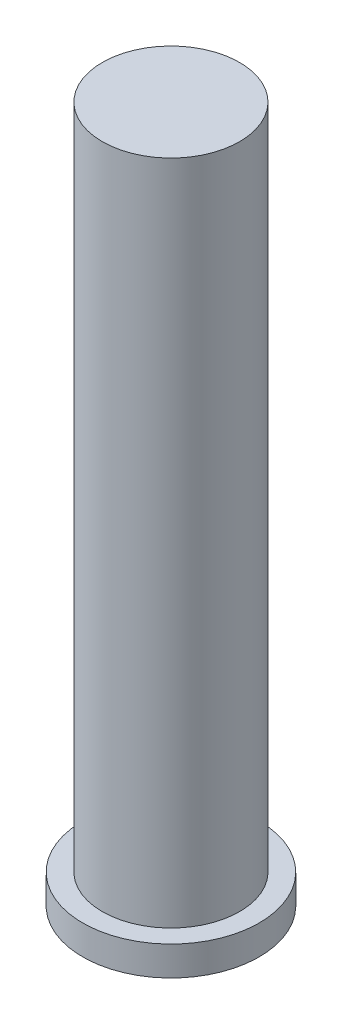
ISO-10303-21;
HEADER;
FILE_DESCRIPTION(('STEP AP214'),'2;1');
FILE_NAME('part.step','',(''),(''),'','','');
FILE_SCHEMA(('AUTOMOTIVE_DESIGN { 1 0 10303 214 1 1 1 1 }'));
ENDSEC;
DATA;
#1=APPLICATION_CONTEXT('core data for automotive mechanical design processes');
#2=APPLICATION_PROTOCOL_DEFINITION('international standard','automotive_design',2000,#1);
#3=PRODUCT_CONTEXT('',#1,'mechanical');
#4=PRODUCT('Part','Part','',(#3));
#5=PRODUCT_RELATED_PRODUCT_CATEGORY('part','',(#4));
#6=PRODUCT_DEFINITION_FORMATION('','',#4);
#7=PRODUCT_DEFINITION_CONTEXT('part definition',#1,'design');
#8=PRODUCT_DEFINITION('design','',#6,#7);
#9=PRODUCT_DEFINITION_SHAPE('','',#8);
#10=(LENGTH_UNIT() NAMED_UNIT(*) SI_UNIT(.MILLI.,.METRE.));
#11=(NAMED_UNIT(*) PLANE_ANGLE_UNIT() SI_UNIT($,.RADIAN.));
#12=(NAMED_UNIT(*) SI_UNIT($,.STERADIAN.) SOLID_ANGLE_UNIT());
#13=UNCERTAINTY_MEASURE_WITH_UNIT(LENGTH_MEASURE(1.E-05),#10,'distance_accuracy_value','');
#14=(GEOMETRIC_REPRESENTATION_CONTEXT(3) GLOBAL_UNCERTAINTY_ASSIGNED_CONTEXT((#13)) GLOBAL_UNIT_ASSIGNED_CONTEXT((#10,
#11,#12)) REPRESENTATION_CONTEXT('',''));
#15=CARTESIAN_POINT('',(0.,0.,0.));
#16=DIRECTION('',(0.,0.,1.));
#17=DIRECTION('',(1.,0.,0.));
#18=AXIS2_PLACEMENT_3D('',#15,#16,#17);
#19=CARTESIAN_POINT('',(0.,0.762,0.));
#20=DIRECTION('',(0.,-1.,0.));
#21=DIRECTION('',(0.,0.,-1.));
#22=AXIS2_PLACEMENT_3D('',#19,#20,#21);
#23=CYLINDRICAL_SURFACE('',#22,2.286);
#24=CARTESIAN_POINT('',(0.,0.762,0.));
#25=DIRECTION('',(0.,1.,0.));
#26=DIRECTION('',(0.,0.,1.));
#27=AXIS2_PLACEMENT_3D('',#24,#25,#26);
#28=CIRCLE('',#27,2.286);
#29=CARTESIAN_POINT('',(0.,0.762,-2.286));
#30=VERTEX_POINT('',#29);
#31=EDGE_CURVE('E40',#30,#30,#28,.T.);
#32=CARTESIAN_POINT('',(0.,0.,0.));
#33=DIRECTION('',(0.,1.,0.));
#34=DIRECTION('',(0.,0.,1.));
#35=AXIS2_PLACEMENT_3D('',#32,#33,#34);
#36=CIRCLE('',#35,2.286);
#37=CARTESIAN_POINT('',(0.,0.,-2.286));
#38=VERTEX_POINT('',#37);
#39=EDGE_CURVE('E36',#38,#38,#36,.T.);
#40=CARTESIAN_POINT('',(0.,0.762,-2.286));
#41=CARTESIAN_POINT('',(0.,0.7540625,-2.286));
#42=CARTESIAN_POINT('',(0.,0.746125,-2.286));
#43=CARTESIAN_POINT('',(0.,0.73025,-2.286));
#44=CARTESIAN_POINT('',(0.,0.7223125,-2.286));
#45=CARTESIAN_POINT('',(0.,0.7064375,-2.286));
#46=CARTESIAN_POINT('',(0.,0.6985,-2.286));
#47=CARTESIAN_POINT('',(0.,0.682625,-2.286));
#48=CARTESIAN_POINT('',(0.,0.6746875,-2.286));
#49=CARTESIAN_POINT('',(0.,0.6588125,-2.286));
#50=CARTESIAN_POINT('',(0.,0.650875,-2.286));
#51=CARTESIAN_POINT('',(0.,0.635,-2.286));
#52=CARTESIAN_POINT('',(0.,0.6270625,-2.286));
#53=CARTESIAN_POINT('',(0.,0.6111875,-2.286));
#54=CARTESIAN_POINT('',(0.,0.60325,-2.286));
#55=CARTESIAN_POINT('',(0.,0.587375,-2.286));
#56=CARTESIAN_POINT('',(0.,0.5794375,-2.286));
#57=CARTESIAN_POINT('',(0.,0.5635625,-2.286));
#58=CARTESIAN_POINT('',(0.,0.555625,-2.286));
#59=CARTESIAN_POINT('',(0.,0.53975,-2.286));
#60=CARTESIAN_POINT('',(0.,0.5318125,-2.286));
#61=CARTESIAN_POINT('',(0.,0.5159375,-2.286));
#62=CARTESIAN_POINT('',(0.,0.508,-2.286));
#63=CARTESIAN_POINT('',(0.,0.492125,-2.286));
#64=CARTESIAN_POINT('',(0.,0.4841875,-2.286));
#65=CARTESIAN_POINT('',(0.,0.4683125,-2.286));
#66=CARTESIAN_POINT('',(0.,0.460375,-2.286));
#67=CARTESIAN_POINT('',(0.,0.4445,-2.286));
#68=CARTESIAN_POINT('',(0.,0.4365625,-2.286));
#69=CARTESIAN_POINT('',(0.,0.4206875,-2.286));
#70=CARTESIAN_POINT('',(0.,0.41275,-2.286));
#71=CARTESIAN_POINT('',(0.,0.396875,-2.286));
#72=CARTESIAN_POINT('',(0.,0.3889375,-2.286));
#73=CARTESIAN_POINT('',(0.,0.3730625,-2.286));
#74=CARTESIAN_POINT('',(0.,0.365125,-2.286));
#75=CARTESIAN_POINT('',(0.,0.34925,-2.286));
#76=CARTESIAN_POINT('',(0.,0.3413125,-2.286));
#77=CARTESIAN_POINT('',(0.,0.3254375,-2.286));
#78=CARTESIAN_POINT('',(0.,0.3175,-2.286));
#79=CARTESIAN_POINT('',(0.,0.301625,-2.286));
#80=CARTESIAN_POINT('',(0.,0.2936875,-2.286));
#81=CARTESIAN_POINT('',(0.,0.2778125,-2.286));
#82=CARTESIAN_POINT('',(0.,0.269875,-2.286));
#83=CARTESIAN_POINT('',(0.,0.254,-2.286));
#84=CARTESIAN_POINT('',(0.,0.2460625,-2.286));
#85=CARTESIAN_POINT('',(0.,0.2301875,-2.286));
#86=CARTESIAN_POINT('',(0.,0.22225,-2.286));
#87=CARTESIAN_POINT('',(0.,0.206375,-2.286));
#88=CARTESIAN_POINT('',(0.,0.1984375,-2.286));
#89=CARTESIAN_POINT('',(0.,0.1825625,-2.286));
#90=CARTESIAN_POINT('',(0.,0.174625,-2.286));
#91=CARTESIAN_POINT('',(0.,0.15875,-2.286));
#92=CARTESIAN_POINT('',(0.,0.1508125,-2.286));
#93=CARTESIAN_POINT('',(0.,0.1349375,-2.286));
#94=CARTESIAN_POINT('',(0.,0.127,-2.286));
#95=CARTESIAN_POINT('',(0.,0.111125,-2.286));
#96=CARTESIAN_POINT('',(0.,0.1031875,-2.286));
#97=CARTESIAN_POINT('',(0.,0.0873125,-2.286));
#98=CARTESIAN_POINT('',(0.,0.079375,-2.286));
#99=CARTESIAN_POINT('',(0.,0.0635,-2.286));
#100=CARTESIAN_POINT('',(0.,0.0555625,-2.286));
#101=CARTESIAN_POINT('',(0.,0.0396875,-2.286));
#102=CARTESIAN_POINT('',(0.,0.03175,-2.286));
#103=CARTESIAN_POINT('',(0.,0.015875,-2.286));
#104=CARTESIAN_POINT('',(0.,0.00793749999999999,-2.286));
#105=CARTESIAN_POINT('',(0.,0.,-2.286));
#106=B_SPLINE_CURVE_WITH_KNOTS('',3,(#40,#41,#42,#43,#44,#45,#46,#47,#48,#49,#50,#51,#52,#53,
#54,#55,#56,#57,#58,#59,#60,#61,#62,#63,#64,#65,#66,#67,#68,#69,#70,#71,#72,#73,#74,#75,#76,#77,
#78,#79,#80,#81,#82,#83,#84,#85,#86,#87,#88,#89,#90,#91,#92,#93,#94,#95,#96,#97,#98,#99,#100,
#101,#102,#103,#104,#105),.UNSPECIFIED.,.F.,.F.,(4,2,2,2,2,2,2,2,2,2,2,2,2,2,2,2,2,2,2,2,2,2,2,
2,2,2,2,2,2,2,2,2,4),(0.,0.0238125,0.0476249999999999,0.0714374999999999,0.09525,0.1190625,
0.142875,0.1666875,0.1905,0.2143125,0.238125,0.2619375,0.28575,0.3095625,0.333375,0.3571875,
0.381,0.4048125,0.428625,0.4524375,0.47625,0.5000625,0.523875,0.5476875,0.5715,0.5953125,
0.619125,0.6429375,0.66675,0.6905625,0.714375,0.7381875,0.762),.UNSPECIFIED.);
#107=EDGE_CURVE('BSEAM33',#30,#38,#106,.T.);
#108=ORIENTED_EDGE('',*,*,#31,.F.);
#109=ORIENTED_EDGE('',*,*,#39,.T.);
#110=ORIENTED_EDGE('',*,*,#107,.T.);
#111=ORIENTED_EDGE('',*,*,#107,.F.);
#112=EDGE_LOOP('',(#108,#110,#109,#111));
#113=FACE_BOUND('',#112,.T.);
#114=ADVANCED_FACE('F33',(#113),#23,.T.);
#115=CARTESIAN_POINT('',(0.,0.762,0.));
#116=DIRECTION('',(0.,1.,0.));
#117=DIRECTION('',(0.,0.,1.));
#118=AXIS2_PLACEMENT_3D('',#115,#116,#117);
#119=PLANE('',#118);
#120=CARTESIAN_POINT('',(0.,0.762,0.));
#121=DIRECTION('',(0.,1.,0.));
#122=DIRECTION('',(0.,0.,1.));
#123=AXIS2_PLACEMENT_3D('',#120,#121,#122);
#124=CIRCLE('',#123,1.778);
#125=CARTESIAN_POINT('',(0.,0.762,1.778));
#126=VERTEX_POINT('',#125);
#127=EDGE_CURVE('E10',#126,#126,#124,.T.);
#128=ORIENTED_EDGE('',*,*,#127,.F.);
#129=EDGE_LOOP('',(#128));
#130=FACE_BOUND('',#129,.T.);
#131=ORIENTED_EDGE('',*,*,#31,.T.);
#132=EDGE_LOOP('',(#131));
#133=FACE_BOUND('',#132,.T.);
#134=ADVANCED_FACE('F57',(#130,#133),#119,.T.);
#135=CARTESIAN_POINT('',(0.,0.,0.));
#136=DIRECTION('',(0.,1.,0.));
#137=DIRECTION('',(0.,0.,1.));
#138=AXIS2_PLACEMENT_3D('',#135,#136,#137);
#139=PLANE('',#138);
#140=ORIENTED_EDGE('',*,*,#39,.F.);
#141=EDGE_LOOP('',(#140));
#142=FACE_BOUND('',#141,.T.);
#143=ADVANCED_FACE('F54',(#142),#139,.F.);
#144=CARTESIAN_POINT('',(0.,18.034,0.));
#145=DIRECTION('',(0.,-1.,0.));
#146=DIRECTION('',(0.,0.,-1.));
#147=AXIS2_PLACEMENT_3D('',#144,#145,#146);
#148=CYLINDRICAL_SURFACE('',#147,1.778);
#149=CARTESIAN_POINT('',(0.,18.034,0.));
#150=DIRECTION('',(0.,1.,0.));
#151=DIRECTION('',(0.,0.,1.));
#152=AXIS2_PLACEMENT_3D('',#149,#150,#151);
#153=CIRCLE('',#152,1.778);
#154=CARTESIAN_POINT('',(0.,18.034,1.778));
#155=VERTEX_POINT('',#154);
#156=EDGE_CURVE('E46',#155,#155,#153,.T.);
#157=ORIENTED_EDGE('',*,*,#156,.F.);
#158=EDGE_LOOP('',(#157));
#159=FACE_BOUND('',#158,.T.);
#160=ORIENTED_EDGE('',*,*,#127,.T.);
#161=EDGE_LOOP('',(#160));
#162=FACE_BOUND('',#161,.T.);
#163=ADVANCED_FACE('F56',(#159,#162),#148,.T.);
#164=CARTESIAN_POINT('',(0.,18.034,0.));
#165=DIRECTION('',(0.,1.,0.));
#166=DIRECTION('',(0.,0.,1.));
#167=AXIS2_PLACEMENT_3D('',#164,#165,#166);
#168=PLANE('',#167);
#169=ORIENTED_EDGE('',*,*,#156,.T.);
#170=EDGE_LOOP('',(#169));
#171=FACE_BOUND('',#170,.T.);
#172=ADVANCED_FACE('F62',(#171),#168,.T.);
#173=CLOSED_SHELL('',(#114,#134,#143,#163,#172));
#174=MANIFOLD_SOLID_BREP('B2',#173);
#175=ADVANCED_BREP_SHAPE_REPRESENTATION('',(#18,#174),#14);
#176=SHAPE_DEFINITION_REPRESENTATION(#9,#175);
ENDSEC;
END-ISO-10303-21;
